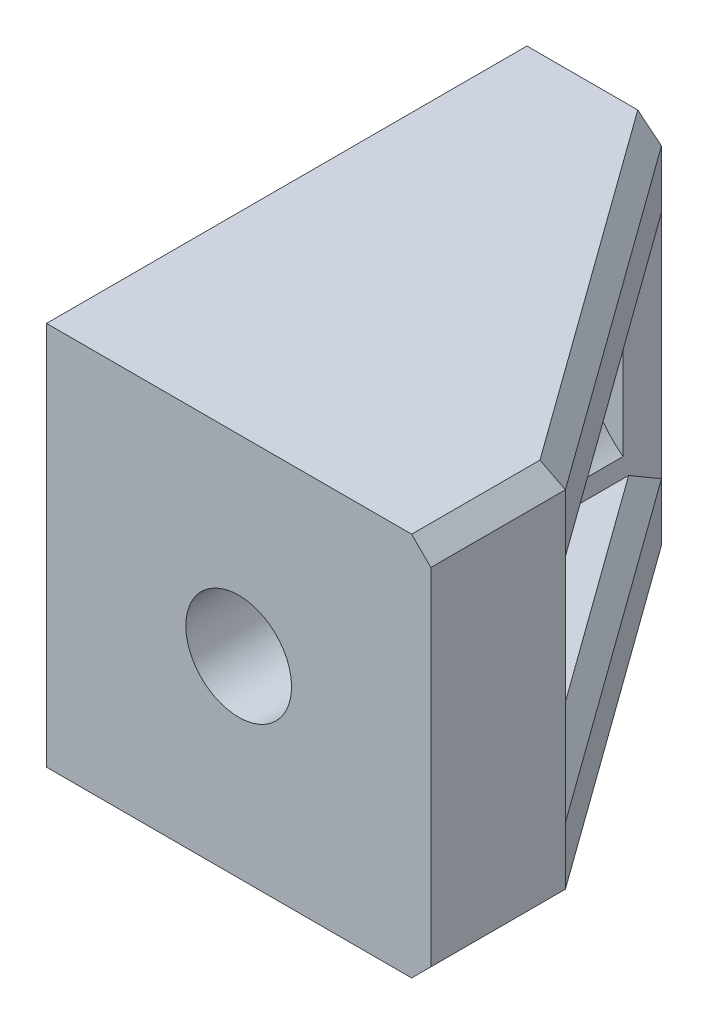
ISO-10303-21;
HEADER;
FILE_DESCRIPTION(('STEP AP214'),'2;1');
FILE_NAME('part.step','',(''),(''),'','','');
FILE_SCHEMA(('AUTOMOTIVE_DESIGN { 1 0 10303 214 1 1 1 1 }'));
ENDSEC;
DATA;
#1=APPLICATION_CONTEXT('core data for automotive mechanical design processes');
#2=APPLICATION_PROTOCOL_DEFINITION('international standard','automotive_design',2000,#1);
#3=PRODUCT_CONTEXT('',#1,'mechanical');
#4=PRODUCT('Part','Part','',(#3));
#5=PRODUCT_RELATED_PRODUCT_CATEGORY('part','',(#4));
#6=PRODUCT_DEFINITION_FORMATION('','',#4);
#7=PRODUCT_DEFINITION_CONTEXT('part definition',#1,'design');
#8=PRODUCT_DEFINITION('design','',#6,#7);
#9=PRODUCT_DEFINITION_SHAPE('','',#8);
#10=(LENGTH_UNIT() NAMED_UNIT(*) SI_UNIT(.MILLI.,.METRE.));
#11=(NAMED_UNIT(*) PLANE_ANGLE_UNIT() SI_UNIT($,.RADIAN.));
#12=(NAMED_UNIT(*) SI_UNIT($,.STERADIAN.) SOLID_ANGLE_UNIT());
#13=UNCERTAINTY_MEASURE_WITH_UNIT(LENGTH_MEASURE(1.E-05),#10,'distance_accuracy_value','');
#14=(GEOMETRIC_REPRESENTATION_CONTEXT(3) GLOBAL_UNCERTAINTY_ASSIGNED_CONTEXT((#13)) GLOBAL_UNIT_ASSIGNED_CONTEXT((#10,
#11,#12)) REPRESENTATION_CONTEXT('',''));
#15=CARTESIAN_POINT('',(0.,0.,0.));
#16=DIRECTION('',(0.,0.,1.));
#17=DIRECTION('',(1.,0.,0.));
#18=AXIS2_PLACEMENT_3D('',#15,#16,#17);
#19=CARTESIAN_POINT('',(32.5056764837603,-437.638253618266,18.769174326131));
#20=DIRECTION('',(-1.,0.,0.));
#21=DIRECTION('',(0.,0.,1.));
#22=AXIS2_PLACEMENT_3D('',#19,#20,#21);
#23=PLANE('',#22);
#24=DIRECTION('',(0.,0.,-1.));
#25=VECTOR('',#24,1.);
#26=CARTESIAN_POINT('',(32.5056764837603,-442.638253618266,18.769174326131));
#27=LINE('',#26,#25);
#28=CARTESIAN_POINT('',(32.5056764837603,-442.638253618266,18.769174326131));
#29=VERTEX_POINT('',#28);
#30=CARTESIAN_POINT('',(32.5056764837603,-442.638253618266,2.47714381160598));
#31=VERTEX_POINT('',#30);
#32=EDGE_CURVE('E155',#29,#31,#27,.T.);
#33=ORIENTED_EDGE('',*,*,#32,.F.);
#34=DIRECTION('',(0.,-1.,0.));
#35=VECTOR('',#34,1.);
#36=CARTESIAN_POINT('',(32.5056764837603,-437.638253618266,18.769174326131));
#37=LINE('',#36,#35);
#38=CARTESIAN_POINT('',(32.5056764837603,-443.638253618266,18.769174326131));
#39=VERTEX_POINT('',#38);
#40=EDGE_CURVE('E162',#29,#39,#37,.T.);
#41=ORIENTED_EDGE('',*,*,#40,.T.);
#42=DIRECTION('',(0.,0.,1.));
#43=VECTOR('',#42,1.);
#44=CARTESIAN_POINT('',(32.5056764837603,-443.638253618266,2.76917432613103));
#45=LINE('',#44,#43);
#46=CARTESIAN_POINT('',(32.5056764837603,-443.638253618266,6.76917432613103));
#47=VERTEX_POINT('',#46);
#48=EDGE_CURVE('E339',#47,#39,#45,.T.);
#49=ORIENTED_EDGE('',*,*,#48,.F.);
#50=CARTESIAN_POINT('',(32.5056764837603,-443.638253618266,2.76917432613103));
#51=VERTEX_POINT('',#50);
#52=EDGE_CURVE('E342',#51,#47,#45,.T.);
#53=ORIENTED_EDGE('',*,*,#52,.F.);
#54=DIRECTION('',(0.,-1.,0.));
#55=VECTOR('',#54,1.);
#56=CARTESIAN_POINT('',(32.5056764837603,-437.638253618266,2.76917432613103));
#57=LINE('',#56,#55);
#58=CARTESIAN_POINT('',(32.5056764837603,-451.638253618266,2.76917432613103));
#59=VERTEX_POINT('',#58);
#60=EDGE_CURVE('E186',#51,#59,#57,.T.);
#61=ORIENTED_EDGE('',*,*,#60,.T.);
#62=DIRECTION('',(0.,0.,1.));
#63=VECTOR('',#62,1.);
#64=CARTESIAN_POINT('',(32.5056764837603,-451.638253618266,2.76917432613103));
#65=LINE('',#64,#63);
#66=CARTESIAN_POINT('',(32.5056764837604,-451.638253618266,6.76917432613103));
#67=VERTEX_POINT('',#66);
#68=EDGE_CURVE('E345',#67,#59,#65,.F.);
#69=ORIENTED_EDGE('',*,*,#68,.F.);
#70=CARTESIAN_POINT('',(32.5056764837603,-451.638253618266,18.769174326131));
#71=VERTEX_POINT('',#70);
#72=EDGE_CURVE('E346',#71,#67,#65,.F.);
#73=ORIENTED_EDGE('',*,*,#72,.F.);
#74=CARTESIAN_POINT('',(32.5056764837603,-452.638253618266,18.769174326131));
#75=VERTEX_POINT('',#74);
#76=EDGE_CURVE('E171',#71,#75,#37,.T.);
#77=ORIENTED_EDGE('',*,*,#76,.T.);
#78=DIRECTION('',(0.,0.,1.));
#79=VECTOR('',#78,1.);
#80=CARTESIAN_POINT('',(32.5056764837603,-452.638253618266,18.769174326131));
#81=LINE('',#80,#79);
#82=CARTESIAN_POINT('',(32.5056764837603,-452.638253618266,2.47714381160604));
#83=VERTEX_POINT('',#82);
#84=EDGE_CURVE('E318',#83,#75,#81,.T.);
#85=ORIENTED_EDGE('',*,*,#84,.F.);
#86=DIRECTION('',(0.,-0.505259348318696,-0.862967549179323));
#87=VECTOR('',#86,1.);
#88=CARTESIAN_POINT('',(32.5056764837603,-441.705257885918,21.1503669072857));
#89=LINE('',#88,#87);
#90=CARTESIAN_POINT('',(32.5056764837603,-453.638253618266,0.769174326131033));
#91=VERTEX_POINT('',#90);
#92=EDGE_CURVE('E275',#83,#91,#89,.T.);
#93=ORIENTED_EDGE('',*,*,#92,.T.);
#94=DIRECTION('',(0.,-1.,0.));
#95=VECTOR('',#94,1.);
#96=CARTESIAN_POINT('',(32.5056764837603,-437.638253618266,0.769174326131033));
#97=LINE('',#96,#95);
#98=CARTESIAN_POINT('',(32.5056764837603,-441.638253618266,0.769174326131033));
#99=VERTEX_POINT('',#98);
#100=EDGE_CURVE('E373',#99,#91,#97,.T.);
#101=ORIENTED_EDGE('',*,*,#100,.F.);
#102=DIRECTION('',(0.,0.505259348318709,-0.862967549179315));
#103=VECTOR('',#102,1.);
#104=CARTESIAN_POINT('',(32.5056764837603,-448.465509169346,12.4299184769149));
#105=LINE('',#104,#103);
#106=EDGE_CURVE('E11',#99,#31,#105,.F.);
#107=ORIENTED_EDGE('',*,*,#106,.T.);
#108=EDGE_LOOP('',(#33,#41,#49,#53,#61,#69,#73,#77,#85,#93,#101,#107));
#109=FACE_BOUND('',#108,.T.);
#110=ADVANCED_FACE('F33',(#109),#23,.F.);
#111=CARTESIAN_POINT('',(45.5056764837601,-437.638253618266,18.769174326131));
#112=DIRECTION('',(0.,0.,1.));
#113=DIRECTION('',(1.,0.,0.));
#114=AXIS2_PLACEMENT_3D('',#111,#112,#113);
#115=PLANE('',#114);
#116=CARTESIAN_POINT('',(35.5056764837604,-447.638253618266,18.769174326131));
#117=DIRECTION('',(0.,0.,-1.));
#118=DIRECTION('',(-1.,0.,0.));
#119=AXIS2_PLACEMENT_3D('',#116,#117,#118);
#120=CIRCLE('',#119,2.75);
#121=CARTESIAN_POINT('',(32.7556764837604,-447.638253618266,18.769174326131));
#122=VERTEX_POINT('',#121);
#123=EDGE_CURVE('E349',#122,#122,#120,.T.);
#124=ORIENTED_EDGE('',*,*,#123,.F.);
#125=EDGE_LOOP('',(#124));
#126=FACE_BOUND('',#125,.T.);
#127=DIRECTION('',(-1.,0.,0.));
#128=VECTOR('',#127,1.);
#129=CARTESIAN_POINT('',(45.5056764837601,-442.638253618266,18.769174326131));
#130=LINE('',#129,#128);
#131=CARTESIAN_POINT('',(44.2721429664727,-442.638253618266,18.769174326131));
#132=VERTEX_POINT('',#131);
#133=EDGE_CURVE('E153',#132,#29,#130,.T.);
#134=ORIENTED_EDGE('',*,*,#133,.F.);
#135=DIRECTION('',(-0.77680574958133,-0.629740285687194,0.));
#136=VECTOR('',#135,1.);
#137=CARTESIAN_POINT('',(47.4624199824193,-440.051962308597,18.769174326131));
#138=LINE('',#137,#136);
#139=CARTESIAN_POINT('',(45.5056764837601,-441.638253618266,18.769174326131));
#140=VERTEX_POINT('',#139);
#141=EDGE_CURVE('E42',#132,#140,#138,.F.);
#142=ORIENTED_EDGE('',*,*,#141,.T.);
#143=DIRECTION('',(0.,-1.,0.));
#144=VECTOR('',#143,1.);
#145=CARTESIAN_POINT('',(45.5056764837601,-437.638253618266,18.769174326131));
#146=LINE('',#145,#144);
#147=CARTESIAN_POINT('',(45.5056764837601,-453.638253618266,18.769174326131));
#148=VERTEX_POINT('',#147);
#149=EDGE_CURVE('E170',#140,#148,#146,.T.);
#150=ORIENTED_EDGE('',*,*,#149,.T.);
#151=DIRECTION('',(-0.77680574958134,0.629740285687182,0.));
#152=VECTOR('',#151,1.);
#153=CARTESIAN_POINT('',(37.6787024891233,-447.293088379588,18.769174326131));
#154=LINE('',#153,#152);
#155=CARTESIAN_POINT('',(44.2721429664726,-452.638253618266,18.769174326131));
#156=VERTEX_POINT('',#155);
#157=EDGE_CURVE('E282',#148,#156,#154,.T.);
#158=ORIENTED_EDGE('',*,*,#157,.T.);
#159=DIRECTION('',(1.,0.,0.));
#160=VECTOR('',#159,1.);
#161=CARTESIAN_POINT('',(45.5056764837601,-452.638253618266,18.769174326131));
#162=LINE('',#161,#160);
#163=EDGE_CURVE('E320',#75,#156,#162,.T.);
#164=ORIENTED_EDGE('',*,*,#163,.F.);
#165=ORIENTED_EDGE('',*,*,#76,.F.);
#166=CARTESIAN_POINT('',(35.5056764837604,-447.638253618266,18.769174326131));
#167=DIRECTION('',(0.,0.,-1.));
#168=DIRECTION('',(-1.,0.,0.));
#169=AXIS2_PLACEMENT_3D('',#166,#167,#168);
#170=CIRCLE('',#169,5.);
#171=EDGE_CURVE('E169',#71,#39,#170,.T.);
#172=ORIENTED_EDGE('',*,*,#171,.T.);
#173=ORIENTED_EDGE('',*,*,#40,.F.);
#174=EDGE_LOOP('',(#134,#142,#150,#158,#164,#165,#172,#173));
#175=FACE_BOUND('',#174,.T.);
#176=ADVANCED_FACE('F167',(#126,#175),#115,.F.);
#177=CARTESIAN_POINT('',(35.5056764837604,-447.638253618266,2.76917432613103));
#178=DIRECTION('',(0.,0.,1.));
#179=DIRECTION('',(1.,0.,0.));
#180=AXIS2_PLACEMENT_3D('',#177,#178,#179);
#181=CYLINDRICAL_SURFACE('',#180,5.);
#182=CARTESIAN_POINT('',(30.5056764837603,-447.638253618266,10.769174326131));
#183=CARTESIAN_POINT('',(30.5056772336888,-447.734300007493,10.7691735584771));
#184=CARTESIAN_POINT('',(30.5084503919735,-447.830361154368,10.7657086248464));
#185=CARTESIAN_POINT('',(30.5194800424015,-448.021710616225,10.7519085073381));
#186=CARTESIAN_POINT('',(30.5277394363657,-448.116998495193,10.7415696876704));
#187=CARTESIAN_POINT('',(30.5495703204804,-448.30614971542,10.7141784431163));
#188=CARTESIAN_POINT('',(30.563150467414,-448.400010474942,10.6971150772312));
#189=CARTESIAN_POINT('',(30.5953150132202,-448.585475458981,10.6565641391688));
#190=CARTESIAN_POINT('',(30.6139016819886,-448.677078639327,10.6330736529374));
#191=CARTESIAN_POINT('',(30.6763254189275,-448.946329198061,10.5538413318735));
#192=CARTESIAN_POINT('',(30.7270006232534,-449.119852284694,10.4891232922572));
#193=CARTESIAN_POINT('',(30.8429697214946,-449.452150995621,10.3389239701378));
#194=CARTESIAN_POINT('',(30.9082636617209,-449.610926573196,10.2534426218582));
#195=CARTESIAN_POINT('',(31.0265482724327,-449.863117547519,10.095487461621));
#196=CARTESIAN_POINT('',(31.0766324802339,-449.960993838032,10.0278269617855));
#197=CARTESIAN_POINT('',(31.1805144626592,-450.14913283723,9.88516859221661));
#198=CARTESIAN_POINT('',(31.234312211006,-450.23939559978,9.8101707744015));
#199=CARTESIAN_POINT('',(31.3446025961316,-450.412424351473,9.65321065161115));
#200=CARTESIAN_POINT('',(31.401102725129,-450.495167404251,9.57122842533727));
#201=CARTESIAN_POINT('',(31.5154162194285,-450.652767439407,9.40093452776233));
#202=CARTESIAN_POINT('',(31.5732290696568,-450.727627452018,9.31262531064676));
#203=CARTESIAN_POINT('',(31.6897971497357,-450.870543695575,9.12843369427747));
#204=CARTESIAN_POINT('',(31.7485528495732,-450.938473871403,9.03245375349262));
#205=CARTESIAN_POINT('',(31.8645470928789,-451.066023568985,8.83419107868873));
#206=CARTESIAN_POINT('',(31.9217851521075,-451.125640463426,8.73190636678362));
#207=CARTESIAN_POINT('',(32.032672418148,-451.236078655677,8.52124681533908));
#208=CARTESIAN_POINT('',(32.0863310929383,-451.286923771995,8.41288956119933));
#209=CARTESIAN_POINT('',(32.1878018327775,-451.379432321206,8.18979162642623));
#210=CARTESIAN_POINT('',(32.2356188772534,-451.421103598563,8.07505650543819));
#211=CARTESIAN_POINT('',(32.3289743771063,-451.499967847043,7.82146390005606));
#212=CARTESIAN_POINT('',(32.3731048518172,-451.535561369666,7.6815636268219));
#213=CARTESIAN_POINT('',(32.4442757844126,-451.591723314881,7.39473621283464));
#214=CARTESIAN_POINT('',(32.471358234991,-451.612328675961,7.24782730464696));
#215=CARTESIAN_POINT('',(32.5039925743845,-451.637049997395,6.94879299486064));
#216=CARTESIAN_POINT('',(32.5093546787671,-451.641020619741,6.79663327873626));
#217=CARTESIAN_POINT('',(32.4968771040533,-451.631643162978,6.49376261819232));
#218=CARTESIAN_POINT('',(32.4790177888787,-451.618280426769,6.34305300859636));
#219=CARTESIAN_POINT('',(32.4192617821095,-451.572160576663,6.02473433123161));
#220=CARTESIAN_POINT('',(32.3740382750167,-451.536693562807,5.8581756258092));
#221=CARTESIAN_POINT('',(32.2657286568622,-451.447140773554,5.53608584370258));
#222=CARTESIAN_POINT('',(32.2025897379737,-451.392999851317,5.38058909402314));
#223=CARTESIAN_POINT('',(32.0834001563342,-451.284184449873,5.11939061214452));
#224=CARTESIAN_POINT('',(32.0296230293777,-451.233138991127,5.01107353749453));
#225=CARTESIAN_POINT('',(31.9186446327296,-451.122409563026,4.80072523165988));
#226=CARTESIAN_POINT('',(31.8614417876809,-451.062721601144,4.69869693689297));
#227=CARTESIAN_POINT('',(31.7454702185576,-450.934965150657,4.50078712432039));
#228=CARTESIAN_POINT('',(31.6866997425926,-450.866886949379,4.40491292951433));
#229=CARTESIAN_POINT('',(31.56922314483,-450.722567639559,4.21950697609924));
#230=CARTESIAN_POINT('',(31.5105170140493,-450.646327873331,4.12997417854815));
#231=CARTESIAN_POINT('',(31.3929694344411,-450.483597813811,3.95516420253477));
#232=CARTESIAN_POINT('',(31.3341664925304,-450.396887629653,3.8700652855213));
#233=CARTESIAN_POINT('',(31.2194217059621,-450.214993550114,3.70726123237505));
#234=CARTESIAN_POINT('',(31.1634802838533,-450.119808408927,3.6295571867626));
#235=CARTESIAN_POINT('',(31.0559281608061,-449.921330150201,3.48241702075801));
#236=CARTESIAN_POINT('',(31.0043078364167,-449.818056097961,3.4129623753495));
#237=CARTESIAN_POINT('',(30.9066289788884,-449.603620113828,3.28304938461428));
#238=CARTESIAN_POINT('',(30.860567937487,-449.492461775417,3.22258697924631));
#239=CARTESIAN_POINT('',(30.7572215392625,-449.213854176977,3.08808760241617));
#240=CARTESIAN_POINT('',(30.703448528957,-449.042508604424,3.01915222623095));
#241=CARTESIAN_POINT('',(30.636126396114,-448.7766271672,2.93344497399219));
#242=CARTESIAN_POINT('',(30.6159058343835,-448.686503660593,2.90782179052764));
#243=CARTESIAN_POINT('',(30.5802851095031,-448.503794178083,2.86281126785388));
#244=CARTESIAN_POINT('',(30.5648826936566,-448.411209374979,2.8434210143566));
#245=CARTESIAN_POINT('',(30.539158037604,-448.22366621606,2.81109381520264));
#246=CARTESIAN_POINT('',(30.5288654468601,-448.128697291042,2.79819452725935));
#247=CARTESIAN_POINT('',(30.5137313528731,-447.937683650079,2.77924340243255));
#248=CARTESIAN_POINT('',(30.5088876126945,-447.841639391962,2.77318875558982));
#249=CARTESIAN_POINT('',(30.504763229925,-447.649232537726,2.76803242625538));
#250=CARTESIAN_POINT('',(30.5054829380642,-447.55286992192,2.7689311821192));
#251=CARTESIAN_POINT('',(30.5124587544053,-447.360689541991,2.77765490406194));
#252=CARTESIAN_POINT('',(30.5187145794732,-447.264871750256,2.78547951593149));
#253=CARTESIAN_POINT('',(30.5441462996807,-446.994877416158,2.81734492759174));
#254=CARTESIAN_POINT('',(30.5697513123532,-446.822163291965,2.8494740107303));
#255=CARTESIAN_POINT('',(30.6373243422395,-446.485550803257,2.93491735361668));
#256=CARTESIAN_POINT('',(30.6792972155014,-446.321655071437,2.98823790057835));
#257=CARTESIAN_POINT('',(30.7798800443094,-445.995791068421,3.1174754601878));
#258=CARTESIAN_POINT('',(30.8393583770255,-445.834568860056,3.19458600338638));
#259=CARTESIAN_POINT('',(30.9700038813076,-445.527431128548,3.36689852404862));
#260=CARTESIAN_POINT('',(31.0411716357679,-445.381516369308,3.46210140372575));
#261=CARTESIAN_POINT('',(31.2058027842247,-445.079749719636,3.68762299942227));
#262=CARTESIAN_POINT('',(31.3009371020318,-444.92723946421,3.82117771883447));
#263=CARTESIAN_POINT('',(31.496806510205,-444.645179641968,4.10794823945742));
#264=CARTESIAN_POINT('',(31.5975570586842,-444.515698019107,4.26121999428382));
#265=CARTESIAN_POINT('',(31.7581937806093,-444.326883886731,4.52204321596129));
#266=CARTESIAN_POINT('',(31.8185816149578,-444.259978786777,4.6238955149544));
#267=CARTESIAN_POINT('',(31.9369681684028,-444.135153575516,4.834418841612));
#268=CARTESIAN_POINT('',(31.9949656082232,-444.077238230584,4.94309344387335));
#269=CARTESIAN_POINT('',(32.106014213487,-443.971078149289,5.16695283766287));
#270=CARTESIAN_POINT('',(32.15908209143,-443.922800048695,5.28211333437391));
#271=CARTESIAN_POINT('',(32.2574957087866,-443.83646430858,5.51925531628622));
#272=CARTESIAN_POINT('',(32.3028509478628,-443.798394062191,5.64122816095324));
#273=CARTESIAN_POINT('',(32.3852880750965,-443.731050306844,5.90134774857211));
#274=CARTESIAN_POINT('',(32.421482148953,-443.702662424126,6.0400196457459));
#275=CARTESIAN_POINT('',(32.475809052395,-443.66067550552,6.32284956184659));
#276=CARTESIAN_POINT('',(32.4939874354583,-443.647039161664,6.46699278203592));
#277=CARTESIAN_POINT('',(32.509181750329,-443.635612439016,6.75787172197468));
#278=CARTESIAN_POINT('',(32.506083974583,-443.637907202579,6.90461718428992));
#279=CARTESIAN_POINT('',(32.4790610406347,-443.658323247505,7.19514276240587));
#280=CARTESIAN_POINT('',(32.4551028621298,-443.676469620813,7.33891780672533));
#281=CARTESIAN_POINT('',(32.3815349928358,-443.734098606845,7.65838763787057));
#282=CARTESIAN_POINT('',(32.3266915014598,-443.778068604434,7.83201949488257));
#283=CARTESIAN_POINT('',(32.1998981442738,-443.88609048078,8.16644228269472));
#284=CARTESIAN_POINT('',(32.127898036333,-443.950201520337,8.32719361051156));
#285=CARTESIAN_POINT('',(31.9958550215954,-444.076356429693,8.59352460994423));
#286=CARTESIAN_POINT('',(31.9379025088168,-444.13420021889,8.70219906372092));
#287=CARTESIAN_POINT('',(31.8195184542637,-444.258959686487,8.91285530867968));
#288=CARTESIAN_POINT('',(31.7590859111751,-444.325879054796,9.01483435251146));
#289=CARTESIAN_POINT('',(31.6375919045539,-444.468597453985,9.21214711241966));
#290=CARTESIAN_POINT('',(31.5765298972134,-444.544404875028,9.30747441177213));
#291=CARTESIAN_POINT('',(31.4554248518646,-444.704731120851,9.4911780272137));
#292=CARTESIAN_POINT('',(31.3953816545319,-444.789248568635,9.57955543815067));
#293=CARTESIAN_POINT('',(31.2769646636669,-444.968112893243,9.75008257445991));
#294=CARTESIAN_POINT('',(31.2186234522843,-445.062574988387,9.83213447434836));
#295=CARTESIAN_POINT('',(31.1058830234005,-445.260277230932,9.98803731860269));
#296=CARTESIAN_POINT('',(31.051484460746,-445.363518830386,10.0618869017001));
#297=CARTESIAN_POINT('',(30.948201216054,-445.578262024008,10.200310898555));
#298=CARTESIAN_POINT('',(30.8993035185704,-445.68974304032,10.264907309484));
#299=CARTESIAN_POINT('',(30.8083497801536,-445.920543738693,10.3839144305715));
#300=CARTESIAN_POINT('',(30.7662895539834,-446.039858562381,10.4383313747107));
#301=CARTESIAN_POINT('',(30.677258165254,-446.328211043998,10.552736141707));
#302=CARTESIAN_POINT('',(30.633609694351,-446.500187088436,10.6081546889026));
#303=CARTESIAN_POINT('',(30.5817410280549,-446.764768794568,10.673698352702));
#304=CARTESIAN_POINT('',(30.5667249973048,-446.853996141877,10.6926079289852));
#305=CARTESIAN_POINT('',(30.541469441189,-447.034184342832,10.7243541068792));
#306=CARTESIAN_POINT('',(30.5312277896242,-447.125144406016,10.7371934118315));
#307=CARTESIAN_POINT('',(30.5175732841573,-447.286477158166,10.7542956817299));
#308=CARTESIAN_POINT('',(30.5131179884136,-447.356628105837,10.7598691602272));
#309=CARTESIAN_POINT('',(30.5071689835072,-447.497267877138,10.7673091765643));
#310=CARTESIAN_POINT('',(30.5056759333221,-447.567756772452,10.7691748895794));
#311=CARTESIAN_POINT('',(30.5056764837603,-447.638253618266,10.769174326131));
#312=B_SPLINE_CURVE_WITH_KNOTS('',3,(#182,#183,#184,#185,#186,#187,#188,#189,#190,#191,#192,
#193,#194,#195,#196,#197,#198,#199,#200,#201,#202,#203,#204,#205,#206,#207,#208,#209,#210,#211,
#212,#213,#214,#215,#216,#217,#218,#219,#220,#221,#222,#223,#224,#225,#226,#227,#228,#229,#230,
#231,#232,#233,#234,#235,#236,#237,#238,#239,#240,#241,#242,#243,#244,#245,#246,#247,#248,#249,
#250,#251,#252,#253,#254,#255,#256,#257,#258,#259,#260,#261,#262,#263,#264,#265,#266,#267,#268,
#269,#270,#271,#272,#273,#274,#275,#276,#277,#278,#279,#280,#281,#282,#283,#284,#285,#286,#287,
#288,#289,#290,#291,#292,#293,#294,#295,#296,#297,#298,#299,#300,#301,#302,#303,#304,#305,#306,
#307,#308,#309,#310,#311),.UNSPECIFIED.,.T.,.F.,(4,2,2,2,2,2,2,2,2,2,2,2,2,2,2,2,2,2,2,2,2,2,2,
2,2,2,2,2,2,2,2,2,2,2,2,2,2,2,2,2,2,2,2,2,2,2,2,2,2,2,2,2,2,2,2,2,2,2,2,2,2,2,2,2,4),(0.,
0.288062758667587,0.576278003111171,0.864964129651124,1.15378136390406,1.72709009312659,
2.30040063856698,2.6872264547426,3.07404953396825,3.46201544535743,3.8498316744471,
4.24376978737862,4.63783211891319,5.03080698743556,5.4234445102455,5.87474837856556,
6.32493619990517,6.77904922175815,7.23354649231943,7.75923125238315,8.28648192165705,
8.67980074282271,9.07330184627997,9.46726282862523,9.86115911639947,10.2656076837236,
10.6701158028797,11.0736976518485,11.47709672477,12.0514034064525,12.33867331582,
12.625808712343,12.91459127094,13.2032552313198,13.4919373897647,13.7806047849778,
14.3106110383655,14.8407746547938,15.4037260006337,15.9667054266293,16.6361816844954,
17.3076015388322,17.7152021542884,18.1230181470312,18.5293968097801,18.9352712520424,
19.3719136407627,19.8074491211245,20.2453140663443,20.6838733784181,21.2427370784728,
21.8032579383454,22.2109901693713,22.6188886741921,23.0271753760052,23.4353976291477,
23.8490189589146,24.2627088316332,24.6753983284757,25.0878342578454,25.6427442660389,
25.9197834242685,26.1966990890724,26.4080865235326,26.6195209777157),.UNSPECIFIED.);
#313=CARTESIAN_POINT('',(30.5056764837603,-447.638253618266,10.769174326131));
#314=VERTEX_POINT('',#313);
#315=EDGE_CURVE('E195',#314,#67,#312,.T.);
#316=ORIENTED_EDGE('',*,*,#315,.F.);
#317=EDGE_CURVE('E188',#47,#314,#312,.T.);
#318=ORIENTED_EDGE('',*,*,#317,.F.);
#319=ORIENTED_EDGE('',*,*,#48,.T.);
#320=ORIENTED_EDGE('',*,*,#171,.F.);
#321=ORIENTED_EDGE('',*,*,#72,.T.);
#322=EDGE_LOOP('',(#316,#318,#319,#320,#321));
#323=FACE_BOUND('',#322,.T.);
#324=ADVANCED_FACE('F220',(#323),#181,.F.);
#325=CARTESIAN_POINT('',(30.5056764837603,-447.638253618266,2.76917432613103));
#326=VERTEX_POINT('',#325);
#327=EDGE_CURVE('E388',#67,#326,#312,.T.);
#328=ORIENTED_EDGE('',*,*,#327,.F.);
#329=ORIENTED_EDGE('',*,*,#68,.T.);
#330=CARTESIAN_POINT('',(35.5056764837604,-447.638253618266,2.76917432613103));
#331=DIRECTION('',(0.,0.,-1.));
#332=DIRECTION('',(-1.,0.,0.));
#333=AXIS2_PLACEMENT_3D('',#330,#331,#332);
#334=CIRCLE('',#333,5.);
#335=EDGE_CURVE('E336',#59,#326,#334,.T.);
#336=ORIENTED_EDGE('',*,*,#335,.T.);
#337=EDGE_LOOP('',(#328,#329,#336));
#338=FACE_BOUND('',#337,.T.);
#339=ADVANCED_FACE('F221',(#338),#181,.F.);
#340=CARTESIAN_POINT('',(25.5056764837603,-447.638253618266,6.76917432613103));
#341=DIRECTION('',(1.,0.,0.));
#342=DIRECTION('',(0.,0.,-1.));
#343=AXIS2_PLACEMENT_3D('',#340,#341,#342);
#344=CYLINDRICAL_SURFACE('',#343,2.25);
#345=CARTESIAN_POINT('',(25.5056764837603,-447.638253618266,6.76917432613103));
#346=DIRECTION('',(1.,0.,0.));
#347=DIRECTION('',(0.,0.,-1.));
#348=AXIS2_PLACEMENT_3D('',#345,#346,#347);
#349=CIRCLE('',#348,2.25);
#350=CARTESIAN_POINT('',(25.5056764837603,-447.638253618266,4.51917432613103));
#351=VERTEX_POINT('',#350);
#352=EDGE_CURVE('E353',#351,#351,#349,.T.);
#353=ORIENTED_EDGE('',*,*,#352,.F.);
#354=EDGE_LOOP('',(#353));
#355=FACE_BOUND('',#354,.T.);
#356=CARTESIAN_POINT('',(30.5056764837603,-447.638253618266,6.76917432613103));
#357=DIRECTION('',(-1.,0.,0.));
#358=DIRECTION('',(0.,0.,1.));
#359=AXIS2_PLACEMENT_3D('',#356,#357,#358);
#360=CIRCLE('',#359,2.25);
#361=CARTESIAN_POINT('',(30.5056764837603,-447.638253618266,9.01917432613104));
#362=VERTEX_POINT('',#361);
#363=EDGE_CURVE('E333',#362,#362,#360,.F.);
#364=ORIENTED_EDGE('',*,*,#363,.T.);
#365=EDGE_LOOP('',(#364));
#366=FACE_BOUND('',#365,.T.);
#367=ADVANCED_FACE('F247',(#355,#366),#344,.F.);
#368=CARTESIAN_POINT('',(25.5056764837603,-437.638253618266,0.769174326131033));
#369=DIRECTION('',(1.,0.,0.));
#370=DIRECTION('',(0.,0.,-1.));
#371=AXIS2_PLACEMENT_3D('',#368,#369,#370);
#372=PLANE('',#371);
#373=DIRECTION('',(0.,-1.,0.));
#374=VECTOR('',#373,1.);
#375=CARTESIAN_POINT('',(25.5056764837603,-437.638253618266,0.769174326131033));
#376=LINE('',#375,#374);
#377=CARTESIAN_POINT('',(25.5056764837603,-437.638253618266,0.769174326131033));
#378=VERTEX_POINT('',#377);
#379=CARTESIAN_POINT('',(25.5056764837603,-457.638253618266,0.769174326131033));
#380=VERTEX_POINT('',#379);
#381=EDGE_CURVE('E367',#378,#380,#376,.T.);
#382=ORIENTED_EDGE('',*,*,#381,.T.);
#383=DIRECTION('',(0.,0.,1.));
#384=VECTOR('',#383,1.);
#385=CARTESIAN_POINT('',(25.5056764837603,-457.638253618266,0.769174326131033));
#386=LINE('',#385,#384);
#387=CARTESIAN_POINT('',(25.5056764837603,-457.638253618266,25.769174326131));
#388=VERTEX_POINT('',#387);
#389=EDGE_CURVE('E358',#380,#388,#386,.T.);
#390=ORIENTED_EDGE('',*,*,#389,.T.);
#391=DIRECTION('',(0.,-1.,0.));
#392=VECTOR('',#391,1.);
#393=CARTESIAN_POINT('',(25.5056764837603,-437.638253618266,25.769174326131));
#394=LINE('',#393,#392);
#395=CARTESIAN_POINT('',(25.5056764837603,-437.638253618266,25.769174326131));
#396=VERTEX_POINT('',#395);
#397=EDGE_CURVE('E184',#396,#388,#394,.T.);
#398=ORIENTED_EDGE('',*,*,#397,.F.);
#399=DIRECTION('',(0.,0.,1.));
#400=VECTOR('',#399,1.);
#401=CARTESIAN_POINT('',(25.5056764837603,-437.638253618266,0.769174326131033));
#402=LINE('',#401,#400);
#403=EDGE_CURVE('E359',#378,#396,#402,.T.);
#404=ORIENTED_EDGE('',*,*,#403,.F.);
#405=EDGE_LOOP('',(#382,#390,#398,#404));
#406=FACE_BOUND('',#405,.T.);
#407=ORIENTED_EDGE('',*,*,#352,.T.);
#408=EDGE_LOOP('',(#407));
#409=FACE_BOUND('',#408,.T.);
#410=ADVANCED_FACE('F243',(#406,#409),#372,.F.);
#411=CARTESIAN_POINT('',(25.5056764837603,-437.638253618266,25.769174326131));
#412=DIRECTION('',(0.,0.,-1.));
#413=DIRECTION('',(-1.,0.,0.));
#414=AXIS2_PLACEMENT_3D('',#411,#412,#413);
#415=PLANE('',#414);
#416=DIRECTION('',(0.,-1.,0.));
#417=VECTOR('',#416,1.);
#418=CARTESIAN_POINT('',(45.5056764837601,-437.638253618266,25.769174326131));
#419=LINE('',#418,#417);
#420=CARTESIAN_POINT('',(45.5056764837601,-438.638253618266,25.769174326131));
#421=VERTEX_POINT('',#420);
#422=CARTESIAN_POINT('',(45.5056764837601,-456.638253618266,25.769174326131));
#423=VERTEX_POINT('',#422);
#424=EDGE_CURVE('E181',#421,#423,#419,.T.);
#425=ORIENTED_EDGE('',*,*,#424,.F.);
#426=DIRECTION('',(-0.707106781186543,0.707106781186552,0.));
#427=VECTOR('',#426,1.);
#428=CARTESIAN_POINT('',(44.5056764837601,-437.638253618266,25.769174326131));
#429=LINE('',#428,#427);
#430=CARTESIAN_POINT('',(44.5056764837601,-437.638253618266,25.769174326131));
#431=VERTEX_POINT('',#430);
#432=EDGE_CURVE('E306',#421,#431,#429,.T.);
#433=ORIENTED_EDGE('',*,*,#432,.T.);
#434=DIRECTION('',(1.,0.,0.));
#435=VECTOR('',#434,1.);
#436=CARTESIAN_POINT('',(25.5056764837603,-437.638253618266,25.769174326131));
#437=LINE('',#436,#435);
#438=EDGE_CURVE('E362',#396,#431,#437,.T.);
#439=ORIENTED_EDGE('',*,*,#438,.F.);
#440=ORIENTED_EDGE('',*,*,#397,.T.);
#441=DIRECTION('',(1.,0.,0.));
#442=VECTOR('',#441,1.);
#443=CARTESIAN_POINT('',(25.5056764837603,-457.638253618266,25.769174326131));
#444=LINE('',#443,#442);
#445=CARTESIAN_POINT('',(44.5056764837601,-457.638253618266,25.769174326131));
#446=VERTEX_POINT('',#445);
#447=EDGE_CURVE('E370',#388,#446,#444,.T.);
#448=ORIENTED_EDGE('',*,*,#447,.T.);
#449=DIRECTION('',(-0.707106781186535,-0.70710678118656,0.));
#450=VECTOR('',#449,1.);
#451=CARTESIAN_POINT('',(45.5056764837601,-456.638253618266,25.769174326131));
#452=LINE('',#451,#450);
#453=EDGE_CURVE('E302',#446,#423,#452,.F.);
#454=ORIENTED_EDGE('',*,*,#453,.T.);
#455=EDGE_LOOP('',(#425,#433,#439,#440,#448,#454));
#456=FACE_BOUND('',#455,.T.);
#457=CARTESIAN_POINT('',(35.5056764837604,-447.638253618266,25.769174326131));
#458=DIRECTION('',(0.,0.,-1.));
#459=DIRECTION('',(-1.,0.,0.));
#460=AXIS2_PLACEMENT_3D('',#457,#458,#459);
#461=CIRCLE('',#460,2.75);
#462=CARTESIAN_POINT('',(32.7556764837604,-447.638253618266,25.769174326131));
#463=VERTEX_POINT('',#462);
#464=EDGE_CURVE('E350',#463,#463,#461,.T.);
#465=ORIENTED_EDGE('',*,*,#464,.T.);
#466=EDGE_LOOP('',(#465));
#467=FACE_BOUND('',#466,.T.);
#468=ADVANCED_FACE('F239',(#456,#467),#415,.F.);
#469=CARTESIAN_POINT('',(45.5056764837601,-437.638253618266,18.769174326131));
#470=DIRECTION('',(-1.,0.,0.));
#471=DIRECTION('',(0.,0.,1.));
#472=AXIS2_PLACEMENT_3D('',#469,#470,#471);
#473=PLANE('',#472);
#474=CARTESIAN_POINT('',(45.5056764837601,-438.638253618266,18.769174326131));
#475=VERTEX_POINT('',#474);
#476=EDGE_CURVE('E173',#475,#140,#146,.T.);
#477=ORIENTED_EDGE('',*,*,#476,.F.);
#478=DIRECTION('',(0.,0.,1.));
#479=VECTOR('',#478,1.);
#480=CARTESIAN_POINT('',(45.5056764837601,-438.638253618266,25.769174326131));
#481=LINE('',#480,#479);
#482=EDGE_CURVE('E539',#475,#421,#481,.T.);
#483=ORIENTED_EDGE('',*,*,#482,.T.);
#484=ORIENTED_EDGE('',*,*,#424,.T.);
#485=DIRECTION('',(0.,0.,-1.));
#486=VECTOR('',#485,1.);
#487=CARTESIAN_POINT('',(45.5056764837601,-456.638253618266,18.769174326131));
#488=LINE('',#487,#486);
#489=CARTESIAN_POINT('',(45.5056764837601,-456.638253618266,18.769174326131));
#490=VERTEX_POINT('',#489);
#491=EDGE_CURVE('E537',#423,#490,#488,.T.);
#492=ORIENTED_EDGE('',*,*,#491,.T.);
#493=DIRECTION('',(0.,1.,0.));
#494=VECTOR('',#493,1.);
#495=CARTESIAN_POINT('',(45.5056764837601,-437.638253618266,18.769174326131));
#496=LINE('',#495,#494);
#497=EDGE_CURVE('E322',#490,#148,#496,.T.);
#498=ORIENTED_EDGE('',*,*,#497,.T.);
#499=ORIENTED_EDGE('',*,*,#149,.F.);
#500=EDGE_LOOP('',(#477,#483,#484,#492,#498,#499));
#501=FACE_BOUND('',#500,.T.);
#502=ADVANCED_FACE('F236',(#501),#473,.F.);
#503=CARTESIAN_POINT('',(25.5056764837603,-437.638253618266,0.769174326131033));
#504=DIRECTION('',(0.,0.,1.));
#505=DIRECTION('',(1.,0.,0.));
#506=AXIS2_PLACEMENT_3D('',#503,#504,#505);
#507=PLANE('',#506);
#508=DIRECTION('',(-1.,0.,0.));
#509=VECTOR('',#508,1.);
#510=CARTESIAN_POINT('',(25.5056764837603,-437.638253618266,0.769174326131033));
#511=LINE('',#510,#509);
#512=CARTESIAN_POINT('',(31.2721429664728,-437.638253618266,0.769174326131033));
#513=VERTEX_POINT('',#512);
#514=EDGE_CURVE('E365',#513,#378,#511,.T.);
#515=ORIENTED_EDGE('',*,*,#514,.F.);
#516=DIRECTION('',(0.77680574958133,-0.629740285687193,0.));
#517=VECTOR('',#516,1.);
#518=CARTESIAN_POINT('',(32.5056764837603,-438.638253618266,0.769174326131033));
#519=LINE('',#518,#517);
#520=CARTESIAN_POINT('',(32.5056764837603,-438.638253618266,0.769174326131033));
#521=VERTEX_POINT('',#520);
#522=EDGE_CURVE('E382',#513,#521,#519,.T.);
#523=ORIENTED_EDGE('',*,*,#522,.T.);
#524=EDGE_CURVE('E176',#521,#99,#97,.T.);
#525=ORIENTED_EDGE('',*,*,#524,.T.);
#526=ORIENTED_EDGE('',*,*,#100,.T.);
#527=DIRECTION('',(0.,1.,0.));
#528=VECTOR('',#527,1.);
#529=CARTESIAN_POINT('',(32.5056764837603,-437.638253618266,0.769174326131033));
#530=LINE('',#529,#528);
#531=CARTESIAN_POINT('',(32.5056764837603,-456.638253618266,0.769174326131033));
#532=VERTEX_POINT('',#531);
#533=EDGE_CURVE('E159',#532,#91,#530,.T.);
#534=ORIENTED_EDGE('',*,*,#533,.F.);
#535=DIRECTION('',(-0.776805749581325,-0.6297402856872,0.));
#536=VECTOR('',#535,1.);
#537=CARTESIAN_POINT('',(24.583062239853,-463.060952420427,0.769174326131033));
#538=LINE('',#537,#536);
#539=CARTESIAN_POINT('',(31.2721429664728,-457.638253618266,0.769174326131033));
#540=VERTEX_POINT('',#539);
#541=EDGE_CURVE('E542',#532,#540,#538,.T.);
#542=ORIENTED_EDGE('',*,*,#541,.T.);
#543=DIRECTION('',(-1.,0.,0.));
#544=VECTOR('',#543,1.);
#545=CARTESIAN_POINT('',(25.5056764837603,-457.638253618266,0.769174326131033));
#546=LINE('',#545,#544);
#547=EDGE_CURVE('E310',#540,#380,#546,.T.);
#548=ORIENTED_EDGE('',*,*,#547,.T.);
#549=ORIENTED_EDGE('',*,*,#381,.F.);
#550=EDGE_LOOP('',(#515,#523,#525,#526,#534,#542,#548,#549));
#551=FACE_BOUND('',#550,.T.);
#552=ADVANCED_FACE('F233',(#551),#507,.F.);
#553=CARTESIAN_POINT('',(0.,-437.638253618266,0.));
#554=DIRECTION('',(0.,1.,0.));
#555=DIRECTION('',(0.,0.,1.));
#556=AXIS2_PLACEMENT_3D('',#553,#554,#555);
#557=PLANE('',#556);
#558=DIRECTION('',(0.,0.,-1.));
#559=VECTOR('',#558,1.);
#560=CARTESIAN_POINT('',(44.5056764837601,-437.638253618266,18.769174326131));
#561=LINE('',#560,#559);
#562=CARTESIAN_POINT('',(44.5056764837601,-437.638253618266,19.0925284269906));
#563=VERTEX_POINT('',#562);
#564=EDGE_CURVE('E387',#431,#563,#561,.T.);
#565=ORIENTED_EDGE('',*,*,#564,.T.);
#566=DIRECTION('',(-0.585490553844354,0.,-0.810679228399884));
#567=VECTOR('',#566,1.);
#568=CARTESIAN_POINT('',(20.1869929590722,-437.638253618266,-14.5794949148853));
#569=LINE('',#568,#567);
#570=EDGE_CURVE('E550',#563,#513,#569,.T.);
#571=ORIENTED_EDGE('',*,*,#570,.T.);
#572=ORIENTED_EDGE('',*,*,#514,.T.);
#573=ORIENTED_EDGE('',*,*,#403,.T.);
#574=ORIENTED_EDGE('',*,*,#438,.T.);
#575=EDGE_LOOP('',(#565,#571,#572,#573,#574));
#576=FACE_BOUND('',#575,.T.);
#577=ADVANCED_FACE('F444',(#576),#557,.T.);
#578=CARTESIAN_POINT('',(0.,-457.638253618266,0.));
#579=DIRECTION('',(0.,1.,0.));
#580=DIRECTION('',(0.,0.,1.));
#581=AXIS2_PLACEMENT_3D('',#578,#579,#580);
#582=PLANE('',#581);
#583=ORIENTED_EDGE('',*,*,#547,.F.);
#584=DIRECTION('',(0.585490553844354,0.,0.810679228399884));
#585=VECTOR('',#584,1.);
#586=CARTESIAN_POINT('',(44.6949972553602,-457.638253618266,19.3546648799754));
#587=LINE('',#586,#585);
#588=CARTESIAN_POINT('',(44.5056764837601,-457.638253618266,19.0925284269906));
#589=VERTEX_POINT('',#588);
#590=EDGE_CURVE('E297',#540,#589,#587,.T.);
#591=ORIENTED_EDGE('',*,*,#590,.T.);
#592=DIRECTION('',(0.,0.,1.));
#593=VECTOR('',#592,1.);
#594=CARTESIAN_POINT('',(44.5056764837601,-457.638253618266,0.));
#595=LINE('',#594,#593);
#596=EDGE_CURVE('E301',#589,#446,#595,.T.);
#597=ORIENTED_EDGE('',*,*,#596,.T.);
#598=ORIENTED_EDGE('',*,*,#447,.F.);
#599=ORIENTED_EDGE('',*,*,#389,.F.);
#600=EDGE_LOOP('',(#583,#591,#597,#598,#599));
#601=FACE_BOUND('',#600,.T.);
#602=ADVANCED_FACE('F222',(#601),#582,.F.);
#603=CARTESIAN_POINT('',(35.5056764837604,-447.638253618266,25.769174326131));
#604=DIRECTION('',(0.,0.,-1.));
#605=DIRECTION('',(-1.,0.,0.));
#606=AXIS2_PLACEMENT_3D('',#603,#604,#605);
#607=CYLINDRICAL_SURFACE('',#606,2.75);
#608=CARTESIAN_POINT('',(32.7556764837604,-447.638253618266,25.769174326131));
#609=CARTESIAN_POINT('',(32.7556764837604,-447.638253618266,25.6962576594644));
#610=CARTESIAN_POINT('',(32.7556764837604,-447.638253618266,25.6233409927977));
#611=CARTESIAN_POINT('',(32.7556764837604,-447.638253618266,25.4775076594644));
#612=CARTESIAN_POINT('',(32.7556764837604,-447.638253618266,25.4045909927977));
#613=CARTESIAN_POINT('',(32.7556764837604,-447.638253618266,25.2587576594644));
#614=CARTESIAN_POINT('',(32.7556764837604,-447.638253618266,25.1858409927977));
#615=CARTESIAN_POINT('',(32.7556764837604,-447.638253618266,25.0400076594644));
#616=CARTESIAN_POINT('',(32.7556764837604,-447.638253618266,24.9670909927977));
#617=CARTESIAN_POINT('',(32.7556764837604,-447.638253618266,24.8212576594644));
#618=CARTESIAN_POINT('',(32.7556764837604,-447.638253618266,24.7483409927977));
#619=CARTESIAN_POINT('',(32.7556764837604,-447.638253618266,24.6025076594644));
#620=CARTESIAN_POINT('',(32.7556764837604,-447.638253618266,24.5295909927977));
#621=CARTESIAN_POINT('',(32.7556764837604,-447.638253618266,24.3837576594644));
#622=CARTESIAN_POINT('',(32.7556764837604,-447.638253618266,24.3108409927977));
#623=CARTESIAN_POINT('',(32.7556764837604,-447.638253618266,24.1650076594644));
#624=CARTESIAN_POINT('',(32.7556764837604,-447.638253618266,24.0920909927977));
#625=CARTESIAN_POINT('',(32.7556764837604,-447.638253618266,23.9462576594644));
#626=CARTESIAN_POINT('',(32.7556764837604,-447.638253618266,23.8733409927977));
#627=CARTESIAN_POINT('',(32.7556764837604,-447.638253618266,23.7275076594644));
#628=CARTESIAN_POINT('',(32.7556764837604,-447.638253618266,23.6545909927977));
#629=CARTESIAN_POINT('',(32.7556764837604,-447.638253618266,23.5087576594644));
#630=CARTESIAN_POINT('',(32.7556764837604,-447.638253618266,23.4358409927977));
#631=CARTESIAN_POINT('',(32.7556764837604,-447.638253618266,23.2900076594644));
#632=CARTESIAN_POINT('',(32.7556764837604,-447.638253618266,23.2170909927977));
#633=CARTESIAN_POINT('',(32.7556764837604,-447.638253618266,23.0712576594644));
#634=CARTESIAN_POINT('',(32.7556764837604,-447.638253618266,22.9983409927977));
#635=CARTESIAN_POINT('',(32.7556764837604,-447.638253618266,22.8525076594644));
#636=CARTESIAN_POINT('',(32.7556764837604,-447.638253618266,22.7795909927977));
#637=CARTESIAN_POINT('',(32.7556764837604,-447.638253618266,22.6337576594644));
#638=CARTESIAN_POINT('',(32.7556764837604,-447.638253618266,22.5608409927977));
#639=CARTESIAN_POINT('',(32.7556764837604,-447.638253618266,22.4150076594644));
#640=CARTESIAN_POINT('',(32.7556764837604,-447.638253618266,22.3420909927977));
#641=CARTESIAN_POINT('',(32.7556764837604,-447.638253618266,22.1962576594644));
#642=CARTESIAN_POINT('',(32.7556764837604,-447.638253618266,22.1233409927977));
#643=CARTESIAN_POINT('',(32.7556764837604,-447.638253618266,21.9775076594644));
#644=CARTESIAN_POINT('',(32.7556764837604,-447.638253618266,21.9045909927977));
#645=CARTESIAN_POINT('',(32.7556764837604,-447.638253618266,21.7587576594644));
#646=CARTESIAN_POINT('',(32.7556764837604,-447.638253618266,21.6858409927977));
#647=CARTESIAN_POINT('',(32.7556764837604,-447.638253618266,21.5400076594644));
#648=CARTESIAN_POINT('',(32.7556764837604,-447.638253618266,21.4670909927977));
#649=CARTESIAN_POINT('',(32.7556764837604,-447.638253618266,21.3212576594644));
#650=CARTESIAN_POINT('',(32.7556764837604,-447.638253618266,21.2483409927977));
#651=CARTESIAN_POINT('',(32.7556764837604,-447.638253618266,21.1025076594644));
#652=CARTESIAN_POINT('',(32.7556764837604,-447.638253618266,21.0295909927977));
#653=CARTESIAN_POINT('',(32.7556764837604,-447.638253618266,20.8837576594644));
#654=CARTESIAN_POINT('',(32.7556764837604,-447.638253618266,20.8108409927977));
#655=CARTESIAN_POINT('',(32.7556764837604,-447.638253618266,20.6650076594644));
#656=CARTESIAN_POINT('',(32.7556764837604,-447.638253618266,20.5920909927977));
#657=CARTESIAN_POINT('',(32.7556764837604,-447.638253618266,20.4462576594644));
#658=CARTESIAN_POINT('',(32.7556764837604,-447.638253618266,20.3733409927977));
#659=CARTESIAN_POINT('',(32.7556764837604,-447.638253618266,20.2275076594644));
#660=CARTESIAN_POINT('',(32.7556764837604,-447.638253618266,20.1545909927977));
#661=CARTESIAN_POINT('',(32.7556764837604,-447.638253618266,20.0087576594644));
#662=CARTESIAN_POINT('',(32.7556764837604,-447.638253618266,19.9358409927977));
#663=CARTESIAN_POINT('',(32.7556764837604,-447.638253618266,19.7900076594644));
#664=CARTESIAN_POINT('',(32.7556764837604,-447.638253618266,19.7170909927977));
#665=CARTESIAN_POINT('',(32.7556764837604,-447.638253618266,19.5712576594644));
#666=CARTESIAN_POINT('',(32.7556764837604,-447.638253618266,19.4983409927977));
#667=CARTESIAN_POINT('',(32.7556764837604,-447.638253618266,19.3525076594644));
#668=CARTESIAN_POINT('',(32.7556764837604,-447.638253618266,19.2795909927977));
#669=CARTESIAN_POINT('',(32.7556764837604,-447.638253618266,19.1337576594644));
#670=CARTESIAN_POINT('',(32.7556764837604,-447.638253618266,19.0608409927977));
#671=CARTESIAN_POINT('',(32.7556764837604,-447.638253618266,18.9150076594644));
#672=CARTESIAN_POINT('',(32.7556764837604,-447.638253618266,18.8420909927977));
#673=CARTESIAN_POINT('',(32.7556764837604,-447.638253618266,18.769174326131));
#674=B_SPLINE_CURVE_WITH_KNOTS('',3,(#608,#609,#610,#611,#612,#613,#614,#615,#616,#617,#618,
#619,#620,#621,#622,#623,#624,#625,#626,#627,#628,#629,#630,#631,#632,#633,#634,#635,#636,#637,
#638,#639,#640,#641,#642,#643,#644,#645,#646,#647,#648,#649,#650,#651,#652,#653,#654,#655,#656,
#657,#658,#659,#660,#661,#662,#663,#664,#665,#666,#667,#668,#669,#670,#671,#672,#673),
.UNSPECIFIED.,.F.,.F.,(4,2,2,2,2,2,2,2,2,2,2,2,2,2,2,2,2,2,2,2,2,2,2,2,2,2,2,2,2,2,2,2,4),(0.,
0.218750000000004,0.437500000000004,0.656250000000004,0.875000000000004,1.09375,1.3125,1.53125,
1.75000000000001,1.96875000000001,2.18750000000001,2.40625000000001,2.62500000000001,
2.84375000000001,3.06250000000001,3.28125000000001,3.50000000000001,3.71875000000001,
3.93750000000001,4.15625000000001,4.37500000000001,4.59375000000001,4.81250000000001,
5.03125000000001,5.25000000000001,5.46875000000001,5.68750000000001,5.90625000000001,
6.12500000000001,6.34375000000001,6.56250000000001,6.78125000000001,7.00000000000001),.UNSPECIFIED.);
#675=EDGE_CURVE('BSEAM213',#463,#122,#674,.T.);
#676=ORIENTED_EDGE('',*,*,#464,.F.);
#677=ORIENTED_EDGE('',*,*,#123,.T.);
#678=ORIENTED_EDGE('',*,*,#675,.T.);
#679=ORIENTED_EDGE('',*,*,#675,.F.);
#680=EDGE_LOOP('',(#676,#678,#677,#679));
#681=FACE_BOUND('',#680,.T.);
#682=ADVANCED_FACE('F213',(#681),#607,.F.);
#683=CARTESIAN_POINT('',(35.5056764837604,-447.638253618266,2.76917432613103));
#684=DIRECTION('',(0.,0.,-1.));
#685=DIRECTION('',(-1.,0.,0.));
#686=AXIS2_PLACEMENT_3D('',#683,#684,#685);
#687=PLANE('',#686);
#688=ORIENTED_EDGE('',*,*,#335,.F.);
#689=ORIENTED_EDGE('',*,*,#60,.F.);
#690=EDGE_CURVE('E340',#326,#51,#334,.T.);
#691=ORIENTED_EDGE('',*,*,#690,.F.);
#692=EDGE_LOOP('',(#688,#689,#691));
#693=FACE_BOUND('',#692,.T.);
#694=ADVANCED_FACE('F211',(#693),#687,.F.);
#695=EDGE_CURVE('E194',#326,#47,#312,.T.);
#696=ORIENTED_EDGE('',*,*,#695,.F.);
#697=ORIENTED_EDGE('',*,*,#690,.T.);
#698=ORIENTED_EDGE('',*,*,#52,.T.);
#699=EDGE_LOOP('',(#696,#697,#698));
#700=FACE_BOUND('',#699,.T.);
#701=ADVANCED_FACE('F198',(#700),#181,.F.);
#702=CARTESIAN_POINT('',(35.5056764837603,-447.638253618266,6.76917432613103));
#703=DIRECTION('',(-1.,0.,0.));
#704=DIRECTION('',(0.,0.,1.));
#705=AXIS2_PLACEMENT_3D('',#702,#703,#704);
#706=CYLINDRICAL_SURFACE('',#705,4.00000000000001);
#707=ORIENTED_EDGE('',*,*,#327,.T.);
#708=CARTESIAN_POINT('',(30.5056764837603,-447.638253618266,6.76917432613103));
#709=DIRECTION('',(-1.,0.,0.));
#710=DIRECTION('',(0.,0.,1.));
#711=AXIS2_PLACEMENT_3D('',#708,#709,#710);
#712=CIRCLE('',#711,4.00000000000001);
#713=EDGE_CURVE('E324',#326,#314,#712,.T.);
#714=ORIENTED_EDGE('',*,*,#713,.T.);
#715=ORIENTED_EDGE('',*,*,#315,.T.);
#716=EDGE_LOOP('',(#707,#714,#715));
#717=FACE_BOUND('',#716,.T.);
#718=ADVANCED_FACE('F209',(#717),#706,.F.);
#719=CARTESIAN_POINT('',(30.5056764837603,-447.638253618266,6.76917432613103));
#720=DIRECTION('',(-1.,0.,0.));
#721=DIRECTION('',(0.,0.,1.));
#722=AXIS2_PLACEMENT_3D('',#719,#720,#721);
#723=PLANE('',#722);
#724=ORIENTED_EDGE('',*,*,#363,.F.);
#725=EDGE_LOOP('',(#724));
#726=FACE_BOUND('',#725,.T.);
#727=EDGE_CURVE('E330',#314,#326,#712,.T.);
#728=ORIENTED_EDGE('',*,*,#727,.F.);
#729=ORIENTED_EDGE('',*,*,#713,.F.);
#730=EDGE_LOOP('',(#728,#729));
#731=FACE_BOUND('',#730,.T.);
#732=ADVANCED_FACE('F207',(#726,#731),#723,.F.);
#733=ORIENTED_EDGE('',*,*,#695,.T.);
#734=ORIENTED_EDGE('',*,*,#317,.T.);
#735=ORIENTED_EDGE('',*,*,#727,.T.);
#736=EDGE_LOOP('',(#733,#734,#735));
#737=FACE_BOUND('',#736,.T.);
#738=ADVANCED_FACE('F202',(#737),#706,.F.);
#739=CARTESIAN_POINT('',(35.5056764837602,-452.638253618266,13.269174326131));
#740=DIRECTION('',(0.,-1.,0.));
#741=DIRECTION('',(0.,0.,-1.));
#742=AXIS2_PLACEMENT_3D('',#739,#740,#741);
#743=PLANE('',#742);
#744=ORIENTED_EDGE('',*,*,#163,.T.);
#745=DIRECTION('',(-0.585490553844354,0.,-0.810679228399884));
#746=VECTOR('',#745,1.);
#747=CARTESIAN_POINT('',(31.6949972553604,-452.638253618266,1.3546648799754));
#748=LINE('',#747,#746);
#749=EDGE_CURVE('E277',#156,#83,#748,.T.);
#750=ORIENTED_EDGE('',*,*,#749,.T.);
#751=ORIENTED_EDGE('',*,*,#84,.T.);
#752=EDGE_LOOP('',(#744,#750,#751));
#753=FACE_BOUND('',#752,.T.);
#754=ADVANCED_FACE('F206',(#753),#743,.F.);
#755=CARTESIAN_POINT('',(32.5056764837603,-457.638253618266,0.769174326131033));
#756=DIRECTION('',(0.810679228399884,0.,-0.585490553844354));
#757=DIRECTION('',(0.585490553844354,0.,0.810679228399884));
#758=AXIS2_PLACEMENT_3D('',#755,#756,#757);
#759=PLANE('',#758);
#760=ORIENTED_EDGE('',*,*,#497,.F.);
#761=DIRECTION('',(-0.585490553844354,0.,-0.810679228399884));
#762=VECTOR('',#761,1.);
#763=CARTESIAN_POINT('',(32.5056764837603,-456.638253618266,0.769174326131033));
#764=LINE('',#763,#762);
#765=EDGE_CURVE('E298',#490,#532,#764,.T.);
#766=ORIENTED_EDGE('',*,*,#765,.T.);
#767=ORIENTED_EDGE('',*,*,#533,.T.);
#768=DIRECTION('',(0.585490553844354,0.,0.810679228399884));
#769=VECTOR('',#768,1.);
#770=CARTESIAN_POINT('',(45.5056764837601,-453.638253618266,18.769174326131));
#771=LINE('',#770,#769);
#772=EDGE_CURVE('E279',#91,#148,#771,.T.);
#773=ORIENTED_EDGE('',*,*,#772,.T.);
#774=EDGE_LOOP('',(#760,#766,#767,#773));
#775=FACE_BOUND('',#774,.T.);
#776=ADVANCED_FACE('F472',(#775),#759,.T.);
#777=CARTESIAN_POINT('',(35.5056764837602,-442.638253618266,13.269174326131));
#778=DIRECTION('',(0.,1.,0.));
#779=DIRECTION('',(0.,0.,1.));
#780=AXIS2_PLACEMENT_3D('',#777,#778,#779);
#781=PLANE('',#780);
#782=ORIENTED_EDGE('',*,*,#32,.T.);
#783=DIRECTION('',(0.585490553844354,0.,0.810679228399884));
#784=VECTOR('',#783,1.);
#785=CARTESIAN_POINT('',(44.6949972553602,-442.638253618266,19.3546648799754));
#786=LINE('',#785,#784);
#787=EDGE_CURVE('E156',#31,#132,#786,.T.);
#788=ORIENTED_EDGE('',*,*,#787,.T.);
#789=ORIENTED_EDGE('',*,*,#133,.T.);
#790=EDGE_LOOP('',(#782,#788,#789));
#791=FACE_BOUND('',#790,.T.);
#792=ADVANCED_FACE('F154',(#791),#781,.F.);
#793=CARTESIAN_POINT('',(32.5056764837603,-437.638253618266,0.769174326131033));
#794=DIRECTION('',(-0.810679228399884,0.,0.585490553844354));
#795=DIRECTION('',(0.585490553844354,0.,0.810679228399884));
#796=AXIS2_PLACEMENT_3D('',#793,#794,#795);
#797=PLANE('',#796);
#798=ORIENTED_EDGE('',*,*,#524,.F.);
#799=DIRECTION('',(-0.585490553844354,0.,-0.810679228399884));
#800=VECTOR('',#799,1.);
#801=CARTESIAN_POINT('',(32.5056764837603,-438.638253618266,0.769174326131033));
#802=LINE('',#801,#800);
#803=EDGE_CURVE('E386',#521,#475,#802,.F.);
#804=ORIENTED_EDGE('',*,*,#803,.T.);
#805=ORIENTED_EDGE('',*,*,#476,.T.);
#806=DIRECTION('',(0.585490553844354,0.,0.810679228399884));
#807=VECTOR('',#806,1.);
#808=CARTESIAN_POINT('',(32.5056764837603,-441.638253618266,0.769174326131033));
#809=LINE('',#808,#807);
#810=EDGE_CURVE('E196',#140,#99,#809,.F.);
#811=ORIENTED_EDGE('',*,*,#810,.T.);
#812=EDGE_LOOP('',(#798,#804,#805,#811));
#813=FACE_BOUND('',#812,.T.);
#814=ADVANCED_FACE('F257',(#813),#797,.F.);
#815=CARTESIAN_POINT('',(44.5056764837601,-437.638253618266,0.));
#816=DIRECTION('',(0.707106781186552,0.707106781186543,0.));
#817=DIRECTION('',(0.,0.,1.));
#818=AXIS2_PLACEMENT_3D('',#815,#816,#817);
#819=PLANE('',#818);
#820=ORIENTED_EDGE('',*,*,#432,.F.);
#821=ORIENTED_EDGE('',*,*,#482,.F.);
#822=DIRECTION('',(-0.689317911332709,0.689317911332718,0.222893773425392));
#823=VECTOR('',#822,1.);
#824=CARTESIAN_POINT('',(47.4391417200093,-440.571718854515,18.1439804131204));
#825=LINE('',#824,#823);
#826=EDGE_CURVE('E164',#563,#475,#825,.F.);
#827=ORIENTED_EDGE('',*,*,#826,.F.);
#828=ORIENTED_EDGE('',*,*,#564,.F.);
#829=EDGE_LOOP('',(#820,#821,#827,#828));
#830=FACE_BOUND('',#829,.T.);
#831=ADVANCED_FACE('F253',(#830),#819,.T.);
#832=CARTESIAN_POINT('',(32.5056764837603,-438.638253618266,0.769174326131033));
#833=DIRECTION('',(0.573236779768639,0.707106781186544,-0.414004340944012));
#834=DIRECTION('',(-0.585490553844354,0.,-0.810679228399884));
#835=AXIS2_PLACEMENT_3D('',#832,#833,#834);
#836=PLANE('',#835);
#837=ORIENTED_EDGE('',*,*,#522,.F.);
#838=ORIENTED_EDGE('',*,*,#570,.F.);
#839=ORIENTED_EDGE('',*,*,#826,.T.);
#840=ORIENTED_EDGE('',*,*,#803,.F.);
#841=EDGE_LOOP('',(#837,#838,#839,#840));
#842=FACE_BOUND('',#841,.T.);
#843=ADVANCED_FACE('F249',(#842),#836,.T.);
#844=CARTESIAN_POINT('',(45.5056764837601,-456.638253618266,18.769174326131));
#845=DIRECTION('',(-0.70710678118656,0.707106781186535,0.));
#846=DIRECTION('',(0.,0.,-1.));
#847=AXIS2_PLACEMENT_3D('',#844,#845,#846);
#848=PLANE('',#847);
#849=ORIENTED_EDGE('',*,*,#453,.F.);
#850=ORIENTED_EDGE('',*,*,#596,.F.);
#851=DIRECTION('',(-0.689317911332701,-0.689317911332725,0.222893773425394));
#852=VECTOR('',#851,1.);
#853=CARTESIAN_POINT('',(45.5056764837601,-456.638253618266,18.769174326131));
#854=LINE('',#853,#852);
#855=EDGE_CURVE('E37',#490,#589,#854,.T.);
#856=ORIENTED_EDGE('',*,*,#855,.F.);
#857=ORIENTED_EDGE('',*,*,#491,.F.);
#858=EDGE_LOOP('',(#849,#850,#856,#857));
#859=FACE_BOUND('',#858,.T.);
#860=ADVANCED_FACE('F252',(#859),#848,.F.);
#861=CARTESIAN_POINT('',(20.1869929590722,-457.638253618266,-14.5794949148853));
#862=DIRECTION('',(0.573236779768644,-0.707106781186538,-0.414004340944016));
#863=DIRECTION('',(-0.585490553844354,0.,-0.810679228399884));
#864=AXIS2_PLACEMENT_3D('',#861,#862,#863);
#865=PLANE('',#864);
#866=ORIENTED_EDGE('',*,*,#541,.F.);
#867=ORIENTED_EDGE('',*,*,#765,.F.);
#868=ORIENTED_EDGE('',*,*,#855,.T.);
#869=ORIENTED_EDGE('',*,*,#590,.F.);
#870=EDGE_LOOP('',(#866,#867,#868,#869));
#871=FACE_BOUND('',#870,.T.);
#872=ADVANCED_FACE('F259',(#871),#865,.T.);
#873=CARTESIAN_POINT('',(32.5056764837603,-453.638253618266,0.769174326131033));
#874=DIRECTION('',(0.57323677976863,0.707106781186555,-0.414004340944006));
#875=DIRECTION('',(-0.585490553844354,0.,-0.810679228399884));
#876=AXIS2_PLACEMENT_3D('',#873,#874,#875);
#877=PLANE('',#876);
#878=ORIENTED_EDGE('',*,*,#92,.F.);
#879=ORIENTED_EDGE('',*,*,#749,.F.);
#880=ORIENTED_EDGE('',*,*,#157,.F.);
#881=ORIENTED_EDGE('',*,*,#772,.F.);
#882=EDGE_LOOP('',(#878,#879,#880,#881));
#883=FACE_BOUND('',#882,.T.);
#884=ADVANCED_FACE('F262',(#883),#877,.T.);
#885=CARTESIAN_POINT('',(38.6564577016078,-442.638253618266,10.9936101132411));
#886=DIRECTION('',(-0.57323677976864,0.707106781186543,0.414004340944013));
#887=DIRECTION('',(0.585490553844354,0.,0.810679228399884));
#888=AXIS2_PLACEMENT_3D('',#885,#886,#887);
#889=PLANE('',#888);
#890=ORIENTED_EDGE('',*,*,#106,.F.);
#891=ORIENTED_EDGE('',*,*,#810,.F.);
#892=ORIENTED_EDGE('',*,*,#141,.F.);
#893=ORIENTED_EDGE('',*,*,#787,.F.);
#894=EDGE_LOOP('',(#890,#891,#892,#893));
#895=FACE_BOUND('',#894,.T.);
#896=ADVANCED_FACE('F35',(#895),#889,.F.);
#897=CLOSED_SHELL('',(#110,#176,#324,#339,#367,#410,#468,#502,#552,#577,#602,#682,#694,#701,
#718,#732,#738,#754,#776,#792,#814,#831,#843,#860,#872,#884,#896));
#898=MANIFOLD_SOLID_BREP('B2',#897);
#899=ADVANCED_BREP_SHAPE_REPRESENTATION('',(#18,#898),#14);
#900=SHAPE_DEFINITION_REPRESENTATION(#9,#899);
ENDSEC;
END-ISO-10303-21;
